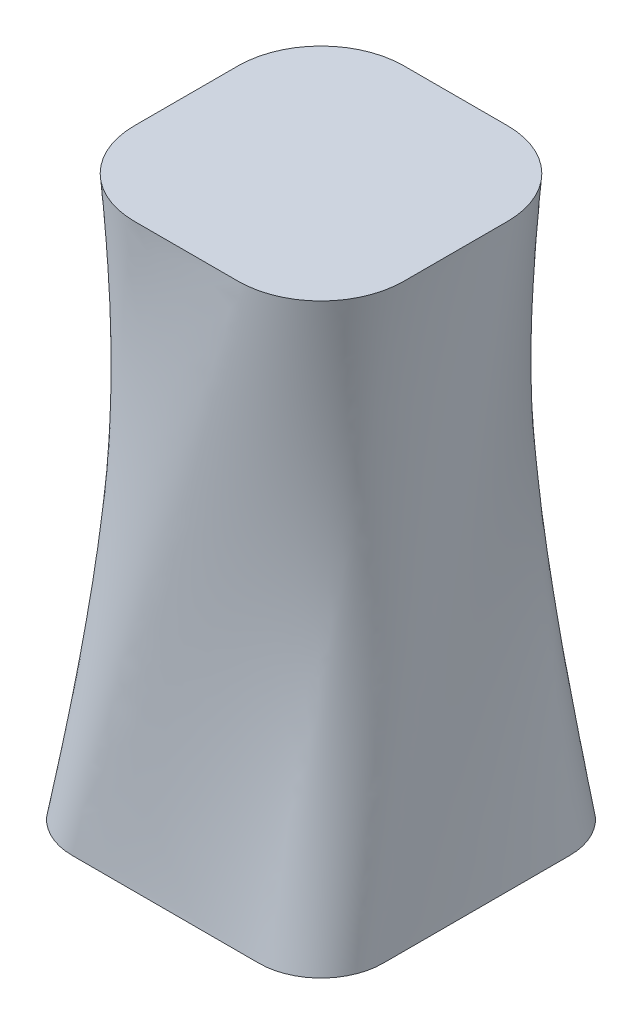
ISO-10303-21;
HEADER;
FILE_DESCRIPTION(('STEP AP214'),'2;1');
FILE_NAME('part.step','',(''),(''),'','','');
FILE_SCHEMA(('AUTOMOTIVE_DESIGN { 1 0 10303 214 1 1 1 1 }'));
ENDSEC;
DATA;
#1=APPLICATION_CONTEXT('core data for automotive mechanical design processes');
#2=APPLICATION_PROTOCOL_DEFINITION('international standard','automotive_design',2000,#1);
#3=PRODUCT_CONTEXT('',#1,'mechanical');
#4=PRODUCT('Part','Part','',(#3));
#5=PRODUCT_RELATED_PRODUCT_CATEGORY('part','',(#4));
#6=PRODUCT_DEFINITION_FORMATION('','',#4);
#7=PRODUCT_DEFINITION_CONTEXT('part definition',#1,'design');
#8=PRODUCT_DEFINITION('design','',#6,#7);
#9=PRODUCT_DEFINITION_SHAPE('','',#8);
#10=(LENGTH_UNIT() NAMED_UNIT(*) SI_UNIT(.MILLI.,.METRE.));
#11=(NAMED_UNIT(*) PLANE_ANGLE_UNIT() SI_UNIT($,.RADIAN.));
#12=(NAMED_UNIT(*) SI_UNIT($,.STERADIAN.) SOLID_ANGLE_UNIT());
#13=UNCERTAINTY_MEASURE_WITH_UNIT(LENGTH_MEASURE(1.E-05),#10,'distance_accuracy_value','');
#14=(GEOMETRIC_REPRESENTATION_CONTEXT(3) GLOBAL_UNCERTAINTY_ASSIGNED_CONTEXT((#13)) GLOBAL_UNIT_ASSIGNED_CONTEXT((#10,
#11,#12)) REPRESENTATION_CONTEXT('',''));
#15=CARTESIAN_POINT('',(0.,0.,0.));
#16=DIRECTION('',(0.,0.,1.));
#17=DIRECTION('',(1.,0.,0.));
#18=AXIS2_PLACEMENT_3D('',#15,#16,#17);
#19=CARTESIAN_POINT('',(2.5,27.,-2.5));
#20=DIRECTION('',(0.,1.,0.));
#21=DIRECTION('',(0.,0.,1.));
#22=AXIS2_PLACEMENT_3D('',#19,#20,#21);
#23=PLANE('',#22);
#24=DIRECTION('',(1.,0.,0.));
#25=VECTOR('',#24,1.);
#26=CARTESIAN_POINT('',(-2.49999999999997,27.,-6.5));
#27=LINE('',#26,#25);
#28=CARTESIAN_POINT('',(-2.49999999999997,27.,-6.5));
#29=VERTEX_POINT('',#28);
#30=CARTESIAN_POINT('',(2.49999999999997,27.,-6.5));
#31=VERTEX_POINT('',#30);
#32=EDGE_CURVE('E313',#29,#31,#27,.T.);
#33=ORIENTED_EDGE('',*,*,#32,.F.);
#34=CARTESIAN_POINT('',(-2.5,27.,-2.5));
#35=DIRECTION('',(0.,1.,0.));
#36=DIRECTION('',(0.,0.,1.));
#37=AXIS2_PLACEMENT_3D('',#34,#35,#36);
#38=CIRCLE('',#37,4.);
#39=CARTESIAN_POINT('',(-6.5,27.,-2.49999999999997));
#40=VERTEX_POINT('',#39);
#41=EDGE_CURVE('E12',#29,#40,#38,.T.);
#42=ORIENTED_EDGE('',*,*,#41,.T.);
#43=DIRECTION('',(0.,0.,1.));
#44=VECTOR('',#43,1.);
#45=CARTESIAN_POINT('',(-6.5,27.,-2.49999999999997));
#46=LINE('',#45,#44);
#47=CARTESIAN_POINT('',(-6.5,27.,2.49999999999997));
#48=VERTEX_POINT('',#47);
#49=EDGE_CURVE('E242',#40,#48,#46,.T.);
#50=ORIENTED_EDGE('',*,*,#49,.T.);
#51=CARTESIAN_POINT('',(-2.5,27.,2.5));
#52=DIRECTION('',(0.,-1.,0.));
#53=DIRECTION('',(0.,0.,-1.));
#54=AXIS2_PLACEMENT_3D('',#51,#52,#53);
#55=CIRCLE('',#54,4.);
#56=CARTESIAN_POINT('',(-2.49999999999997,27.,6.5));
#57=VERTEX_POINT('',#56);
#58=EDGE_CURVE('E441',#57,#48,#55,.T.);
#59=ORIENTED_EDGE('',*,*,#58,.F.);
#60=DIRECTION('',(1.,0.,0.));
#61=VECTOR('',#60,1.);
#62=CARTESIAN_POINT('',(-2.49999999999997,27.,6.5));
#63=LINE('',#62,#61);
#64=CARTESIAN_POINT('',(2.49999999999997,27.,6.5));
#65=VERTEX_POINT('',#64);
#66=EDGE_CURVE('E453',#57,#65,#63,.T.);
#67=ORIENTED_EDGE('',*,*,#66,.T.);
#68=CARTESIAN_POINT('',(2.5,27.,2.5));
#69=DIRECTION('',(0.,1.,0.));
#70=DIRECTION('',(0.,0.,1.));
#71=AXIS2_PLACEMENT_3D('',#68,#69,#70);
#72=CIRCLE('',#71,4.);
#73=CARTESIAN_POINT('',(6.5,27.,2.49999999999997));
#74=VERTEX_POINT('',#73);
#75=EDGE_CURVE('E463',#65,#74,#72,.T.);
#76=ORIENTED_EDGE('',*,*,#75,.T.);
#77=DIRECTION('',(0.,0.,1.));
#78=VECTOR('',#77,1.);
#79=CARTESIAN_POINT('',(6.5,27.,-2.49999999999997));
#80=LINE('',#79,#78);
#81=CARTESIAN_POINT('',(6.5,27.,-2.49999999999997));
#82=VERTEX_POINT('',#81);
#83=EDGE_CURVE('E254',#82,#74,#80,.T.);
#84=ORIENTED_EDGE('',*,*,#83,.F.);
#85=CARTESIAN_POINT('',(2.5,27.,-2.5));
#86=DIRECTION('',(0.,1.,0.));
#87=DIRECTION('',(0.,0.,1.));
#88=AXIS2_PLACEMENT_3D('',#85,#86,#87);
#89=CIRCLE('',#88,4.);
#90=EDGE_CURVE('E249',#82,#31,#89,.T.);
#91=ORIENTED_EDGE('',*,*,#90,.T.);
#92=EDGE_LOOP('',(#33,#42,#50,#59,#67,#76,#84,#91));
#93=FACE_BOUND('',#92,.T.);
#94=ADVANCED_FACE('F232',(#93),#23,.T.);
#95=CARTESIAN_POINT('',(-4.5,0.,-4.5));
#96=DIRECTION('',(0.,-1.,0.));
#97=DIRECTION('',(0.,0.,-1.));
#98=AXIS2_PLACEMENT_3D('',#95,#96,#97);
#99=PLANE('',#98);
#100=CARTESIAN_POINT('',(-4.5,0.,-4.5));
#101=DIRECTION('',(0.,-1.,0.));
#102=DIRECTION('',(0.,0.,-1.));
#103=AXIS2_PLACEMENT_3D('',#100,#101,#102);
#104=CIRCLE('',#103,3.);
#105=CARTESIAN_POINT('',(-7.5,0.,-4.49999999999998));
#106=VERTEX_POINT('',#105);
#107=CARTESIAN_POINT('',(-4.49999999981882,0.,-7.5));
#108=VERTEX_POINT('',#107);
#109=EDGE_CURVE('E307',#106,#108,#104,.T.);
#110=ORIENTED_EDGE('',*,*,#109,.T.);
#111=DIRECTION('',(1.,0.,0.));
#112=VECTOR('',#111,1.);
#113=CARTESIAN_POINT('',(-4.49999999999998,0.,-7.5));
#114=LINE('',#113,#112);
#115=CARTESIAN_POINT('',(4.49999999999849,0.,-7.5));
#116=VERTEX_POINT('',#115);
#117=EDGE_CURVE('E376',#108,#116,#114,.T.);
#118=ORIENTED_EDGE('',*,*,#117,.T.);
#119=CARTESIAN_POINT('',(4.5,0.,-4.5));
#120=DIRECTION('',(0.,1.,0.));
#121=DIRECTION('',(0.,0.,1.));
#122=AXIS2_PLACEMENT_3D('',#119,#120,#121);
#123=CIRCLE('',#122,3.);
#124=CARTESIAN_POINT('',(7.5,0.,-4.49999999981934));
#125=VERTEX_POINT('',#124);
#126=EDGE_CURVE('E382',#125,#116,#123,.T.);
#127=ORIENTED_EDGE('',*,*,#126,.F.);
#128=DIRECTION('',(0.,0.,1.));
#129=VECTOR('',#128,1.);
#130=CARTESIAN_POINT('',(7.5,0.,-4.49999999999998));
#131=LINE('',#130,#129);
#132=CARTESIAN_POINT('',(7.5,0.,4.49999999999849));
#133=VERTEX_POINT('',#132);
#134=EDGE_CURVE('E387',#125,#133,#131,.T.);
#135=ORIENTED_EDGE('',*,*,#134,.T.);
#136=CARTESIAN_POINT('',(4.5,0.,4.5));
#137=DIRECTION('',(0.,1.,0.));
#138=DIRECTION('',(0.,0.,1.));
#139=AXIS2_PLACEMENT_3D('',#136,#137,#138);
#140=CIRCLE('',#139,3.);
#141=CARTESIAN_POINT('',(4.49999999981934,0.,7.5));
#142=VERTEX_POINT('',#141);
#143=EDGE_CURVE('E629',#142,#133,#140,.T.);
#144=ORIENTED_EDGE('',*,*,#143,.F.);
#145=DIRECTION('',(1.,0.,0.));
#146=VECTOR('',#145,1.);
#147=CARTESIAN_POINT('',(-4.49999999999998,0.,7.5));
#148=LINE('',#147,#146);
#149=CARTESIAN_POINT('',(-4.49999999999849,0.,7.5));
#150=VERTEX_POINT('',#149);
#151=EDGE_CURVE('E320',#150,#142,#148,.T.);
#152=ORIENTED_EDGE('',*,*,#151,.F.);
#153=CARTESIAN_POINT('',(-4.5,0.,4.5));
#154=DIRECTION('',(0.,-1.,0.));
#155=DIRECTION('',(0.,0.,-1.));
#156=AXIS2_PLACEMENT_3D('',#153,#154,#155);
#157=CIRCLE('',#156,3.);
#158=CARTESIAN_POINT('',(-7.5,0.,4.49999999999998));
#159=VERTEX_POINT('',#158);
#160=EDGE_CURVE('E301',#150,#159,#157,.T.);
#161=ORIENTED_EDGE('',*,*,#160,.T.);
#162=DIRECTION('',(0.,0.,1.));
#163=VECTOR('',#162,1.);
#164=CARTESIAN_POINT('',(-7.5,0.,-4.49999999999998));
#165=LINE('',#164,#163);
#166=EDGE_CURVE('E299',#106,#159,#165,.T.);
#167=ORIENTED_EDGE('',*,*,#166,.F.);
#168=EDGE_LOOP('',(#110,#118,#127,#135,#144,#152,#161,#167));
#169=FACE_BOUND('',#168,.T.);
#170=ADVANCED_FACE('F312',(#169),#99,.T.);
#171=CARTESIAN_POINT('',(-4.49999999822571,0.,-7.5));
#172=CARTESIAN_POINT('',(-6.5,27.,-2.49999999854001));
#173=CARTESIAN_POINT('',(-4.94953581701786,0.,-7.5));
#174=CARTESIAN_POINT('',(-6.5,27.,-2.13010121971556));
#175=CARTESIAN_POINT('',(-5.74164405353183,0.,-7.30832111887032));
#176=CARTESIAN_POINT('',(-6.49999999999999,27.,-1.33334988671003));
#177=CARTESIAN_POINT('',(-6.66974926873419,0.,-6.66974926873417));
#178=CARTESIAN_POINT('',(-6.50000000000001,27.,0.));
#179=CARTESIAN_POINT('',(-7.30832111887033,0.,-5.74164405353181));
#180=CARTESIAN_POINT('',(-6.5,27.,1.33334988671002));
#181=CARTESIAN_POINT('',(-7.5,0.,-4.94953581701784));
#182=CARTESIAN_POINT('',(-6.5,27.,2.13010121971555));
#183=CARTESIAN_POINT('',(-7.5,0.,-3.80683673824408));
#184=CARTESIAN_POINT('',(-6.5,27.,3.07036665826937));
#185=CARTESIAN_POINT('',(-7.5,0.,-2.34563645766832));
#186=CARTESIAN_POINT('',(-6.26152497008049,27.,4.12778504698234));
#187=CARTESIAN_POINT('',(-7.5,0.,0.));
#188=CARTESIAN_POINT('',(-5.39537330169935,27.,5.39537330169934));
#189=CARTESIAN_POINT('',(-7.5,0.,2.34563645766832));
#190=CARTESIAN_POINT('',(-4.12778504698232,27.,6.2615249700805));
#191=CARTESIAN_POINT('',(-7.5,0.,3.80683673824408));
#192=CARTESIAN_POINT('',(-3.07036665826936,27.,6.50000000000001));
#193=CARTESIAN_POINT('',(-7.5,0.,4.94953581701785));
#194=CARTESIAN_POINT('',(-2.13010121971555,27.,6.5));
#195=CARTESIAN_POINT('',(-7.30832111887033,0.,5.7416440535318));
#196=CARTESIAN_POINT('',(-1.33334988671002,27.,6.49999999999999));
#197=CARTESIAN_POINT('',(-6.66974926873417,0.,6.6697492687342));
#198=CARTESIAN_POINT('',(0.,27.,6.50000000000001));
#199=CARTESIAN_POINT('',(-5.74164405353182,0.,7.30832111887031));
#200=CARTESIAN_POINT('',(1.33334988671002,27.,6.49999999999999));
#201=CARTESIAN_POINT('',(-4.94953581701784,0.,7.5));
#202=CARTESIAN_POINT('',(2.13010121971555,27.,6.5));
#203=CARTESIAN_POINT('',(-3.80683673824408,0.,7.5));
#204=CARTESIAN_POINT('',(3.07036665826936,27.,6.5));
#205=CARTESIAN_POINT('',(-2.34563645766832,0.,7.5));
#206=CARTESIAN_POINT('',(4.12778504698233,27.,6.26152497008049));
#207=CARTESIAN_POINT('',(0.,0.,7.49999999999999));
#208=CARTESIAN_POINT('',(5.39537330169934,27.,5.39537330169934));
#209=CARTESIAN_POINT('',(2.34563645766832,0.,7.50000000000001));
#210=CARTESIAN_POINT('',(6.2615249700805,27.,4.12778504698233));
#211=CARTESIAN_POINT('',(3.80683673824408,0.,7.5));
#212=CARTESIAN_POINT('',(6.5,27.,3.07036665826936));
#213=CARTESIAN_POINT('',(4.94953581701784,0.,7.5));
#214=CARTESIAN_POINT('',(6.5,27.,2.13010121971555));
#215=CARTESIAN_POINT('',(5.74164405353183,0.,7.30832111887032));
#216=CARTESIAN_POINT('',(6.49999999999999,27.,1.33334988671002));
#217=CARTESIAN_POINT('',(6.66974926873417,0.,6.66974926873419));
#218=CARTESIAN_POINT('',(6.5,27.,0.));
#219=CARTESIAN_POINT('',(7.30832111887033,0.,5.74164405353181));
#220=CARTESIAN_POINT('',(6.5,27.,-1.33334988671003));
#221=CARTESIAN_POINT('',(7.5,0.,4.94953581701785));
#222=CARTESIAN_POINT('',(6.5,27.,-2.13010121971556));
#223=CARTESIAN_POINT('',(7.5,0.,3.80683673824408));
#224=CARTESIAN_POINT('',(6.5,27.,-3.07036665826937));
#225=CARTESIAN_POINT('',(7.49999999999999,0.,2.34563645766832));
#226=CARTESIAN_POINT('',(6.26152497008049,27.,-4.12778504698233));
#227=CARTESIAN_POINT('',(7.5,0.,0.));
#228=CARTESIAN_POINT('',(5.39537330169935,27.,-5.39537330169935));
#229=CARTESIAN_POINT('',(7.5,0.,-2.34563645766831));
#230=CARTESIAN_POINT('',(4.12778504698233,27.,-6.26152497008049));
#231=CARTESIAN_POINT('',(7.5,0.,-3.80683673824408));
#232=CARTESIAN_POINT('',(3.07036665826937,27.,-6.5));
#233=CARTESIAN_POINT('',(7.5,0.,-4.94953581701784));
#234=CARTESIAN_POINT('',(2.13010121971555,27.,-6.5));
#235=CARTESIAN_POINT('',(7.30832111887032,0.,-5.74164405353182));
#236=CARTESIAN_POINT('',(1.33334988671002,27.,-6.49999999999999));
#237=CARTESIAN_POINT('',(6.66974926873418,0.,-6.66974926873419));
#238=CARTESIAN_POINT('',(0.,27.,-6.50000000000001));
#239=CARTESIAN_POINT('',(5.74164405353182,0.,-7.30832111887032));
#240=CARTESIAN_POINT('',(-1.33334988671002,27.,-6.49999999999999));
#241=CARTESIAN_POINT('',(4.94953581701784,0.,-7.5));
#242=CARTESIAN_POINT('',(-2.13010121971555,27.,-6.5));
#243=CARTESIAN_POINT('',(3.80683673824408,0.,-7.5));
#244=CARTESIAN_POINT('',(-3.07036665826936,27.,-6.5));
#245=CARTESIAN_POINT('',(2.34563645766832,0.,-7.49999999999999));
#246=CARTESIAN_POINT('',(-4.12778504698234,27.,-6.2615249700805));
#247=CARTESIAN_POINT('',(0.,0.,-7.50000000000001));
#248=CARTESIAN_POINT('',(-5.39537330169934,27.,-5.39537330169935));
#249=CARTESIAN_POINT('',(-2.34563645766832,0.,-7.5));
#250=CARTESIAN_POINT('',(-6.2615249700805,27.,-4.12778504698233));
#251=CARTESIAN_POINT('',(-3.80683673824408,0.,-7.5));
#252=CARTESIAN_POINT('',(-6.5,27.,-3.07036665826936));
#253=CARTESIAN_POINT('',(-4.49999999822571,0.,-7.5));
#254=CARTESIAN_POINT('',(-6.5,27.,-2.49999999854001));
#255=B_SPLINE_SURFACE_WITH_KNOTS('',3,1,((#171,#172),(#173,#174),(#175,#176),(#177,#178),(#179,
#180),(#181,#182),(#183,#184),(#185,#186),(#187,#188),(#189,#190),(#191,#192),(#193,#194),(#195,
#196),(#197,#198),(#199,#200),(#201,#202),(#203,#204),(#205,#206),(#207,#208),(#209,#210),(#211,
#212),(#213,#214),(#215,#216),(#217,#218),(#219,#220),(#221,#222),(#223,#224),(#225,#226),(#227,
#228),(#229,#230),(#231,#232),(#233,#234),(#235,#236),(#237,#238),(#239,#240),(#241,#242),(#243,
#244),(#245,#246),(#247,#248),(#249,#250),(#251,#252),(#253,#254)),.UNSPECIFIED.,.T.,.F.,.F.,(4,
1,1,1,2,1,1,1,2,1,1,1,2,1,1,1,2,1,1,1,2,1,1,1,2,1,1,1,2,1,1,1,4),(2,2),(0.,0.0245873906756441,
0.0491747813512883,0.0737621720269324,0.0983495627025766,0.136262172026932,0.174174781351288,
0.212087390675644,0.25,0.274587390675644,0.299174781351288,0.323762172026932,0.348349562702577,
0.386262172026932,0.424174781351288,0.462087390675644,0.5,0.524587390675644,0.549174781351288,
0.573762172026932,0.598349562702577,0.636262172026932,0.674174781351288,0.712087390675644,0.75,
0.774587390675644,0.799174781351288,0.823762172026933,0.848349562702577,0.886262172026933,
0.924174781351288,0.962087390675644,1.),(0.,1.),.UNSPECIFIED.);
#256=ORIENTED_EDGE('',*,*,#166,.T.);
#257=ORIENTED_EDGE('',*,*,#160,.F.);
#258=ORIENTED_EDGE('',*,*,#151,.T.);
#259=ORIENTED_EDGE('',*,*,#143,.T.);
#260=ORIENTED_EDGE('',*,*,#134,.F.);
#261=ORIENTED_EDGE('',*,*,#126,.T.);
#262=ORIENTED_EDGE('',*,*,#117,.F.);
#263=ORIENTED_EDGE('',*,*,#109,.F.);
#264=EDGE_LOOP('',(#256,#257,#258,#259,#260,#261,#262,#263));
#265=FACE_BOUND('',#264,.T.);
#266=ORIENTED_EDGE('',*,*,#32,.T.);
#267=ORIENTED_EDGE('',*,*,#90,.F.);
#268=ORIENTED_EDGE('',*,*,#83,.T.);
#269=ORIENTED_EDGE('',*,*,#75,.F.);
#270=ORIENTED_EDGE('',*,*,#66,.F.);
#271=ORIENTED_EDGE('',*,*,#58,.T.);
#272=ORIENTED_EDGE('',*,*,#49,.F.);
#273=ORIENTED_EDGE('',*,*,#41,.F.);
#274=EDGE_LOOP('',(#266,#267,#268,#269,#270,#271,#272,#273));
#275=FACE_BOUND('',#274,.T.);
#276=ADVANCED_FACE('F303',(#265,#275),#255,.T.);
#277=CLOSED_SHELL('',(#94,#170,#276));
#278=MANIFOLD_SOLID_BREP('B2',#277);
#279=ADVANCED_BREP_SHAPE_REPRESENTATION('',(#18,#278),#14);
#280=SHAPE_DEFINITION_REPRESENTATION(#9,#279);
ENDSEC;
END-ISO-10303-21;
